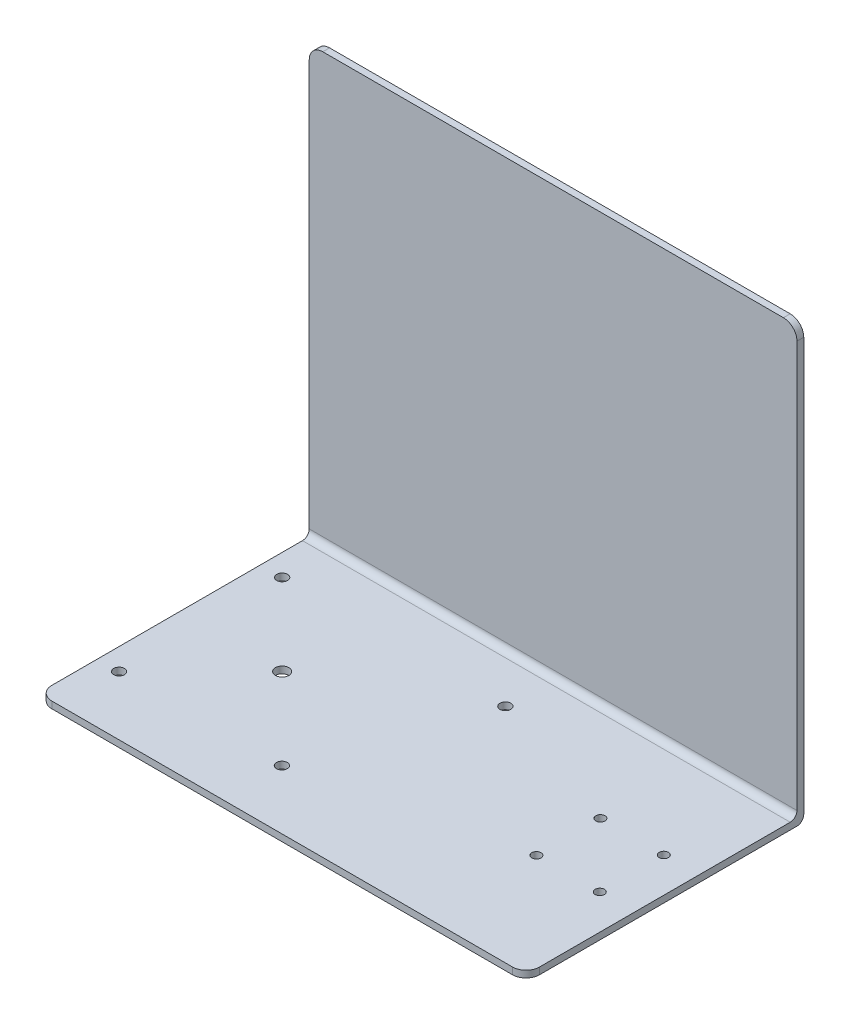
ISO-10303-21;
HEADER;
FILE_DESCRIPTION(('STEP AP214'),'2;1');
FILE_NAME('part.step','',(''),(''),'','','');
FILE_SCHEMA(('AUTOMOTIVE_DESIGN { 1 0 10303 214 1 1 1 1 }'));
ENDSEC;
DATA;
#1=APPLICATION_CONTEXT('core data for automotive mechanical design processes');
#2=APPLICATION_PROTOCOL_DEFINITION('international standard','automotive_design',2000,#1);
#3=PRODUCT_CONTEXT('',#1,'mechanical');
#4=PRODUCT('Part','Part','',(#3));
#5=PRODUCT_RELATED_PRODUCT_CATEGORY('part','',(#4));
#6=PRODUCT_DEFINITION_FORMATION('','',#4);
#7=PRODUCT_DEFINITION_CONTEXT('part definition',#1,'design');
#8=PRODUCT_DEFINITION('design','',#6,#7);
#9=PRODUCT_DEFINITION_SHAPE('','',#8);
#10=(LENGTH_UNIT() NAMED_UNIT(*) SI_UNIT(.MILLI.,.METRE.));
#11=(NAMED_UNIT(*) PLANE_ANGLE_UNIT() SI_UNIT($,.RADIAN.));
#12=(NAMED_UNIT(*) SI_UNIT($,.STERADIAN.) SOLID_ANGLE_UNIT());
#13=UNCERTAINTY_MEASURE_WITH_UNIT(LENGTH_MEASURE(1.E-05),#10,'distance_accuracy_value','');
#14=(GEOMETRIC_REPRESENTATION_CONTEXT(3) GLOBAL_UNCERTAINTY_ASSIGNED_CONTEXT((#13)) GLOBAL_UNIT_ASSIGNED_CONTEXT((#10,
#11,#12)) REPRESENTATION_CONTEXT('',''));
#15=CARTESIAN_POINT('',(0.,0.,0.));
#16=DIRECTION('',(0.,0.,1.));
#17=DIRECTION('',(1.,0.,0.));
#18=AXIS2_PLACEMENT_3D('',#15,#16,#17);
#19=CARTESIAN_POINT('',(0.,0.,3.175));
#20=DIRECTION('',(0.,0.,-1.));
#21=DIRECTION('',(-1.,0.,0.));
#22=AXIS2_PLACEMENT_3D('',#19,#20,#21);
#23=PLANE('',#22);
#24=DIRECTION('',(0.,1.,0.));
#25=VECTOR('',#24,1.);
#26=CARTESIAN_POINT('',(114.3,-101.6,3.175));
#27=LINE('',#26,#25);
#28=CARTESIAN_POINT('',(114.3,-95.25,3.175));
#29=VERTEX_POINT('',#28);
#30=CARTESIAN_POINT('',(114.3,95.25,3.175));
#31=VERTEX_POINT('',#30);
#32=EDGE_CURVE('E215',#29,#31,#27,.T.);
#33=ORIENTED_EDGE('',*,*,#32,.T.);
#34=CARTESIAN_POINT('',(107.95,95.25,3.175));
#35=DIRECTION('',(0.,0.,-1.));
#36=DIRECTION('',(-1.,0.,0.));
#37=AXIS2_PLACEMENT_3D('',#34,#35,#36);
#38=CIRCLE('',#37,6.35);
#39=CARTESIAN_POINT('',(107.95,101.6,3.175));
#40=VERTEX_POINT('',#39);
#41=EDGE_CURVE('E180',#31,#40,#38,.F.);
#42=ORIENTED_EDGE('',*,*,#41,.T.);
#43=DIRECTION('',(-1.,0.,0.));
#44=VECTOR('',#43,1.);
#45=CARTESIAN_POINT('',(-114.3,101.6,3.175));
#46=LINE('',#45,#44);
#47=CARTESIAN_POINT('',(-107.95,101.6,3.175));
#48=VERTEX_POINT('',#47);
#49=EDGE_CURVE('E218',#40,#48,#46,.T.);
#50=ORIENTED_EDGE('',*,*,#49,.T.);
#51=CARTESIAN_POINT('',(-107.95,95.25,3.175));
#52=DIRECTION('',(0.,0.,-1.));
#53=DIRECTION('',(-1.,0.,0.));
#54=AXIS2_PLACEMENT_3D('',#51,#52,#53);
#55=CIRCLE('',#54,6.35);
#56=CARTESIAN_POINT('',(-114.3,95.25,3.175));
#57=VERTEX_POINT('',#56);
#58=EDGE_CURVE('E178',#48,#57,#55,.F.);
#59=ORIENTED_EDGE('',*,*,#58,.T.);
#60=DIRECTION('',(0.,-1.,0.));
#61=VECTOR('',#60,1.);
#62=CARTESIAN_POINT('',(-114.3,-101.6,3.175));
#63=LINE('',#62,#61);
#64=CARTESIAN_POINT('',(-114.3,-95.25,3.175));
#65=VERTEX_POINT('',#64);
#66=EDGE_CURVE('E135',#57,#65,#63,.T.);
#67=ORIENTED_EDGE('',*,*,#66,.T.);
#68=DIRECTION('',(-1.,0.,0.));
#69=VECTOR('',#68,1.);
#70=CARTESIAN_POINT('',(114.3,-95.25,3.175));
#71=LINE('',#70,#69);
#72=EDGE_CURVE('E158',#65,#29,#71,.F.);
#73=ORIENTED_EDGE('',*,*,#72,.T.);
#74=EDGE_LOOP('',(#33,#42,#50,#59,#67,#73));
#75=FACE_BOUND('',#74,.T.);
#76=ADVANCED_FACE('F33',(#75),#23,.F.);
#77=CARTESIAN_POINT('',(114.3,-101.6,3.175));
#78=DIRECTION('',(-1.,0.,0.));
#79=DIRECTION('',(0.,0.,1.));
#80=AXIS2_PLACEMENT_3D('',#77,#78,#79);
#81=PLANE('',#80);
#82=DIRECTION('',(0.,1.,0.));
#83=VECTOR('',#82,1.);
#84=CARTESIAN_POINT('',(114.3,-101.6,0.));
#85=LINE('',#84,#83);
#86=CARTESIAN_POINT('',(114.3,-98.425,0.));
#87=VERTEX_POINT('',#86);
#88=CARTESIAN_POINT('',(114.3,95.25,0.));
#89=VERTEX_POINT('',#88);
#90=EDGE_CURVE('E214',#87,#89,#85,.T.);
#91=ORIENTED_EDGE('',*,*,#90,.T.);
#92=DIRECTION('',(0.,0.,-1.));
#93=VECTOR('',#92,1.);
#94=CARTESIAN_POINT('',(114.3,95.25,3.175));
#95=LINE('',#94,#93);
#96=EDGE_CURVE('E176',#89,#31,#95,.F.);
#97=ORIENTED_EDGE('',*,*,#96,.T.);
#98=ORIENTED_EDGE('',*,*,#32,.F.);
#99=CARTESIAN_POINT('',(114.3,-95.25,6.34999999999999));
#100=DIRECTION('',(-1.,0.,0.));
#101=DIRECTION('',(0.,0.,1.));
#102=AXIS2_PLACEMENT_3D('',#99,#100,#101);
#103=CIRCLE('',#102,3.175);
#104=CARTESIAN_POINT('',(114.3,-98.425,6.34999999999999));
#105=VERTEX_POINT('',#104);
#106=EDGE_CURVE('E163',#29,#105,#103,.T.);
#107=ORIENTED_EDGE('',*,*,#106,.T.);
#108=DIRECTION('',(0.,0.,-1.));
#109=VECTOR('',#108,1.);
#110=CARTESIAN_POINT('',(114.3,-98.425,130.175));
#111=LINE('',#110,#109);
#112=CARTESIAN_POINT('',(114.3,-98.425,123.825));
#113=VERTEX_POINT('',#112);
#114=EDGE_CURVE('E207',#113,#105,#111,.T.);
#115=ORIENTED_EDGE('',*,*,#114,.F.);
#116=DIRECTION('',(0.,1.,0.));
#117=VECTOR('',#116,1.);
#118=CARTESIAN_POINT('',(114.3,-101.6,123.825));
#119=LINE('',#118,#117);
#120=CARTESIAN_POINT('',(114.3,-101.6,123.825));
#121=VERTEX_POINT('',#120);
#122=EDGE_CURVE('E130',#113,#121,#119,.F.);
#123=ORIENTED_EDGE('',*,*,#122,.T.);
#124=DIRECTION('',(0.,0.,-1.));
#125=VECTOR('',#124,1.);
#126=CARTESIAN_POINT('',(114.3,-101.6,3.175));
#127=LINE('',#126,#125);
#128=CARTESIAN_POINT('',(114.3,-101.6,3.175));
#129=VERTEX_POINT('',#128);
#130=EDGE_CURVE('E123',#121,#129,#127,.T.);
#131=ORIENTED_EDGE('',*,*,#130,.T.);
#132=CARTESIAN_POINT('',(114.3,-98.425,3.175));
#133=DIRECTION('',(-1.,0.,0.));
#134=DIRECTION('',(0.,0.,1.));
#135=AXIS2_PLACEMENT_3D('',#132,#133,#134);
#136=CIRCLE('',#135,3.175);
#137=EDGE_CURVE('E127',#129,#87,#136,.F.);
#138=ORIENTED_EDGE('',*,*,#137,.T.);
#139=EDGE_LOOP('',(#91,#97,#98,#107,#115,#123,#131,#138));
#140=FACE_BOUND('',#139,.T.);
#141=ADVANCED_FACE('F126',(#140),#81,.F.);
#142=CARTESIAN_POINT('',(-114.3,101.6,3.175));
#143=DIRECTION('',(0.,-1.,0.));
#144=DIRECTION('',(0.,0.,-1.));
#145=AXIS2_PLACEMENT_3D('',#142,#143,#144);
#146=PLANE('',#145);
#147=ORIENTED_EDGE('',*,*,#49,.F.);
#148=DIRECTION('',(0.,0.,-1.));
#149=VECTOR('',#148,1.);
#150=CARTESIAN_POINT('',(107.95,101.6,3.175));
#151=LINE('',#150,#149);
#152=CARTESIAN_POINT('',(107.95,101.6,0.));
#153=VERTEX_POINT('',#152);
#154=EDGE_CURVE('E168',#40,#153,#151,.T.);
#155=ORIENTED_EDGE('',*,*,#154,.T.);
#156=DIRECTION('',(-1.,0.,0.));
#157=VECTOR('',#156,1.);
#158=CARTESIAN_POINT('',(-114.3,101.6,0.));
#159=LINE('',#158,#157);
#160=CARTESIAN_POINT('',(-107.95,101.6,0.));
#161=VERTEX_POINT('',#160);
#162=EDGE_CURVE('E224',#153,#161,#159,.T.);
#163=ORIENTED_EDGE('',*,*,#162,.T.);
#164=DIRECTION('',(0.,0.,-1.));
#165=VECTOR('',#164,1.);
#166=CARTESIAN_POINT('',(-107.95,101.6,3.175));
#167=LINE('',#166,#165);
#168=EDGE_CURVE('E166',#161,#48,#167,.F.);
#169=ORIENTED_EDGE('',*,*,#168,.T.);
#170=EDGE_LOOP('',(#147,#155,#163,#169));
#171=FACE_BOUND('',#170,.T.);
#172=ADVANCED_FACE('F242',(#171),#146,.F.);
#173=CARTESIAN_POINT('',(-114.3,-101.6,3.175));
#174=DIRECTION('',(1.,0.,0.));
#175=DIRECTION('',(0.,0.,-1.));
#176=AXIS2_PLACEMENT_3D('',#173,#174,#175);
#177=PLANE('',#176);
#178=ORIENTED_EDGE('',*,*,#66,.F.);
#179=DIRECTION('',(0.,0.,-1.));
#180=VECTOR('',#179,1.);
#181=CARTESIAN_POINT('',(-114.3,95.25,3.175));
#182=LINE('',#181,#180);
#183=CARTESIAN_POINT('',(-114.3,95.25,0.));
#184=VERTEX_POINT('',#183);
#185=EDGE_CURVE('E184',#57,#184,#182,.T.);
#186=ORIENTED_EDGE('',*,*,#185,.T.);
#187=DIRECTION('',(0.,-1.,0.));
#188=VECTOR('',#187,1.);
#189=CARTESIAN_POINT('',(-114.3,-101.6,0.));
#190=LINE('',#189,#188);
#191=CARTESIAN_POINT('',(-114.3,-98.425,0.));
#192=VERTEX_POINT('',#191);
#193=EDGE_CURVE('E219',#184,#192,#190,.T.);
#194=ORIENTED_EDGE('',*,*,#193,.T.);
#195=CARTESIAN_POINT('',(-114.3,-98.425,3.175));
#196=DIRECTION('',(1.,0.,0.));
#197=DIRECTION('',(0.,0.,-1.));
#198=AXIS2_PLACEMENT_3D('',#195,#196,#197);
#199=CIRCLE('',#198,3.175);
#200=CARTESIAN_POINT('',(-114.3,-101.6,3.175));
#201=VERTEX_POINT('',#200);
#202=EDGE_CURVE('E153',#192,#201,#199,.F.);
#203=ORIENTED_EDGE('',*,*,#202,.T.);
#204=DIRECTION('',(0.,0.,-1.));
#205=VECTOR('',#204,1.);
#206=CARTESIAN_POINT('',(-114.3,-101.6,3.175));
#207=LINE('',#206,#205);
#208=CARTESIAN_POINT('',(-114.3,-101.6,123.825));
#209=VERTEX_POINT('',#208);
#210=EDGE_CURVE('E134',#209,#201,#207,.T.);
#211=ORIENTED_EDGE('',*,*,#210,.F.);
#212=DIRECTION('',(0.,-1.,0.));
#213=VECTOR('',#212,1.);
#214=CARTESIAN_POINT('',(-114.3,-101.6,123.825));
#215=LINE('',#214,#213);
#216=CARTESIAN_POINT('',(-114.3,-98.425,123.825));
#217=VERTEX_POINT('',#216);
#218=EDGE_CURVE('E182',#209,#217,#215,.F.);
#219=ORIENTED_EDGE('',*,*,#218,.T.);
#220=DIRECTION('',(0.,0.,-1.));
#221=VECTOR('',#220,1.);
#222=CARTESIAN_POINT('',(-114.3,-98.425,130.175));
#223=LINE('',#222,#221);
#224=CARTESIAN_POINT('',(-114.3,-98.425,6.34999999999999));
#225=VERTEX_POINT('',#224);
#226=EDGE_CURVE('E205',#217,#225,#223,.T.);
#227=ORIENTED_EDGE('',*,*,#226,.T.);
#228=CARTESIAN_POINT('',(-114.3,-95.25,6.34999999999999));
#229=DIRECTION('',(1.,0.,0.));
#230=DIRECTION('',(0.,0.,-1.));
#231=AXIS2_PLACEMENT_3D('',#228,#229,#230);
#232=CIRCLE('',#231,3.175);
#233=EDGE_CURVE('E160',#225,#65,#232,.T.);
#234=ORIENTED_EDGE('',*,*,#233,.T.);
#235=EDGE_LOOP('',(#178,#186,#194,#203,#211,#219,#227,#234));
#236=FACE_BOUND('',#235,.T.);
#237=ADVANCED_FACE('F201',(#236),#177,.F.);
#238=CARTESIAN_POINT('',(-114.3,-101.6,3.175));
#239=DIRECTION('',(0.,1.,0.));
#240=DIRECTION('',(0.,0.,1.));
#241=AXIS2_PLACEMENT_3D('',#238,#239,#240);
#242=PLANE('',#241);
#243=CARTESIAN_POINT('',(68.2499999999999,-101.6,49.2493000000003));
#244=DIRECTION('',(0.,1.,0.));
#245=DIRECTION('',(0.,0.,1.));
#246=AXIS2_PLACEMENT_3D('',#243,#244,#245);
#247=CIRCLE('',#246,2.14999999999999);
#248=CARTESIAN_POINT('',(68.2499999999999,-101.6,51.3993000000003));
#249=VERTEX_POINT('',#248);
#250=EDGE_CURVE('E371',#249,#249,#247,.T.);
#251=ORIENTED_EDGE('',*,*,#250,.T.);
#252=EDGE_LOOP('',(#251));
#253=FACE_BOUND('',#252,.T.);
#254=CARTESIAN_POINT('',(-27.8257,-101.6,102.4636));
#255=DIRECTION('',(0.,1.,0.));
#256=DIRECTION('',(0.,0.,1.));
#257=AXIS2_PLACEMENT_3D('',#254,#255,#256);
#258=CIRCLE('',#257,2.53999999999999);
#259=CARTESIAN_POINT('',(-27.8257,-101.6,105.0036));
#260=VERTEX_POINT('',#259);
#261=EDGE_CURVE('E364',#260,#260,#258,.T.);
#262=ORIENTED_EDGE('',*,*,#261,.T.);
#263=EDGE_LOOP('',(#262));
#264=FACE_BOUND('',#263,.T.);
#265=CARTESIAN_POINT('',(0.482599999999993,-101.6,26.035));
#266=DIRECTION('',(0.,1.,0.));
#267=DIRECTION('',(0.,0.,1.));
#268=AXIS2_PLACEMENT_3D('',#265,#266,#267);
#269=CIRCLE('',#268,2.54);
#270=CARTESIAN_POINT('',(0.482599999999993,-101.6,28.575));
#271=VERTEX_POINT('',#270);
#272=EDGE_CURVE('E383',#271,#271,#269,.T.);
#273=ORIENTED_EDGE('',*,*,#272,.T.);
#274=EDGE_LOOP('',(#273));
#275=FACE_BOUND('',#274,.T.);
#276=CARTESIAN_POINT('',(-104.14,-101.6,102.4636));
#277=DIRECTION('',(0.,1.,0.));
#278=DIRECTION('',(0.,0.,1.));
#279=AXIS2_PLACEMENT_3D('',#276,#277,#278);
#280=CIRCLE('',#279,2.53999999999998);
#281=CARTESIAN_POINT('',(-104.14,-101.6,105.0036));
#282=VERTEX_POINT('',#281);
#283=EDGE_CURVE('E376',#282,#282,#280,.T.);
#284=ORIENTED_EDGE('',*,*,#283,.T.);
#285=EDGE_LOOP('',(#284));
#286=FACE_BOUND('',#285,.T.);
#287=CARTESIAN_POINT('',(-65.9257,-101.6,64.2493));
#288=DIRECTION('',(0.,1.,0.));
#289=DIRECTION('',(0.,0.,1.));
#290=AXIS2_PLACEMENT_3D('',#287,#288,#289);
#291=CIRCLE('',#290,3.175);
#292=CARTESIAN_POINT('',(-65.9257,-101.6,67.4243));
#293=VERTEX_POINT('',#292);
#294=EDGE_CURVE('E342',#293,#293,#291,.T.);
#295=ORIENTED_EDGE('',*,*,#294,.T.);
#296=EDGE_LOOP('',(#295));
#297=FACE_BOUND('',#296,.T.);
#298=CARTESIAN_POINT('',(97.9499999999999,-101.6,79.2493));
#299=DIRECTION('',(0.,1.,0.));
#300=DIRECTION('',(0.,0.,1.));
#301=AXIS2_PLACEMENT_3D('',#298,#299,#300);
#302=CIRCLE('',#301,2.14999999999999);
#303=CARTESIAN_POINT('',(97.9499999999999,-101.6,81.3993));
#304=VERTEX_POINT('',#303);
#305=EDGE_CURVE('E337',#304,#304,#302,.T.);
#306=ORIENTED_EDGE('',*,*,#305,.T.);
#307=EDGE_LOOP('',(#306));
#308=FACE_BOUND('',#307,.T.);
#309=CARTESIAN_POINT('',(68.2499999999999,-101.6,79.2493));
#310=DIRECTION('',(0.,1.,0.));
#311=DIRECTION('',(0.,0.,1.));
#312=AXIS2_PLACEMENT_3D('',#309,#310,#311);
#313=CIRCLE('',#312,2.15);
#314=CARTESIAN_POINT('',(68.2499999999999,-101.6,81.3993));
#315=VERTEX_POINT('',#314);
#316=EDGE_CURVE('E359',#315,#315,#313,.T.);
#317=ORIENTED_EDGE('',*,*,#316,.T.);
#318=EDGE_LOOP('',(#317));
#319=FACE_BOUND('',#318,.T.);
#320=CARTESIAN_POINT('',(97.9499999999999,-101.6,49.2493000000001));
#321=DIRECTION('',(0.,1.,0.));
#322=DIRECTION('',(0.,0.,1.));
#323=AXIS2_PLACEMENT_3D('',#320,#321,#322);
#324=CIRCLE('',#323,2.14999999999999);
#325=CARTESIAN_POINT('',(97.9499999999999,-101.6,51.3993000000001));
#326=VERTEX_POINT('',#325);
#327=EDGE_CURVE('E352',#326,#326,#324,.T.);
#328=ORIENTED_EDGE('',*,*,#327,.T.);
#329=EDGE_LOOP('',(#328));
#330=FACE_BOUND('',#329,.T.);
#331=CARTESIAN_POINT('',(-104.14,-101.6,26.035));
#332=DIRECTION('',(0.,1.,0.));
#333=DIRECTION('',(0.,0.,1.));
#334=AXIS2_PLACEMENT_3D('',#331,#332,#333);
#335=CIRCLE('',#334,2.53999999999998);
#336=CARTESIAN_POINT('',(-104.14,-101.6,28.575));
#337=VERTEX_POINT('',#336);
#338=EDGE_CURVE('E209',#337,#337,#335,.T.);
#339=ORIENTED_EDGE('',*,*,#338,.T.);
#340=EDGE_LOOP('',(#339));
#341=FACE_BOUND('',#340,.T.);
#342=ORIENTED_EDGE('',*,*,#130,.F.);
#343=CARTESIAN_POINT('',(107.95,-101.6,123.825));
#344=DIRECTION('',(0.,1.,0.));
#345=DIRECTION('',(0.,0.,1.));
#346=AXIS2_PLACEMENT_3D('',#343,#344,#345);
#347=CIRCLE('',#346,6.35);
#348=CARTESIAN_POINT('',(107.95,-101.6,130.175));
#349=VERTEX_POINT('',#348);
#350=EDGE_CURVE('E11',#121,#349,#347,.F.);
#351=ORIENTED_EDGE('',*,*,#350,.T.);
#352=DIRECTION('',(1.,0.,0.));
#353=VECTOR('',#352,1.);
#354=CARTESIAN_POINT('',(-114.3,-101.6,130.175));
#355=LINE('',#354,#353);
#356=CARTESIAN_POINT('',(-107.95,-101.6,130.175));
#357=VERTEX_POINT('',#356);
#358=EDGE_CURVE('E195',#357,#349,#355,.T.);
#359=ORIENTED_EDGE('',*,*,#358,.F.);
#360=CARTESIAN_POINT('',(-107.95,-101.6,123.825));
#361=DIRECTION('',(0.,1.,0.));
#362=DIRECTION('',(0.,0.,1.));
#363=AXIS2_PLACEMENT_3D('',#360,#361,#362);
#364=CIRCLE('',#363,6.35);
#365=EDGE_CURVE('E41',#357,#209,#364,.F.);
#366=ORIENTED_EDGE('',*,*,#365,.T.);
#367=ORIENTED_EDGE('',*,*,#210,.T.);
#368=DIRECTION('',(1.,0.,0.));
#369=VECTOR('',#368,1.);
#370=CARTESIAN_POINT('',(114.3,-101.6,3.175));
#371=LINE('',#370,#369);
#372=EDGE_CURVE('E142',#201,#129,#371,.T.);
#373=ORIENTED_EDGE('',*,*,#372,.T.);
#374=EDGE_LOOP('',(#342,#351,#359,#366,#367,#373));
#375=FACE_BOUND('',#374,.T.);
#376=ADVANCED_FACE('F146',(#253,#264,#275,#286,#297,#308,#319,#330,#341,#375),#242,.F.);
#377=CARTESIAN_POINT('',(0.,0.,0.));
#378=DIRECTION('',(0.,0.,-1.));
#379=DIRECTION('',(-1.,0.,0.));
#380=AXIS2_PLACEMENT_3D('',#377,#378,#379);
#381=PLANE('',#380);
#382=ORIENTED_EDGE('',*,*,#162,.F.);
#383=CARTESIAN_POINT('',(107.95,95.25,0.));
#384=DIRECTION('',(0.,0.,-1.));
#385=DIRECTION('',(-1.,0.,0.));
#386=AXIS2_PLACEMENT_3D('',#383,#384,#385);
#387=CIRCLE('',#386,6.35);
#388=EDGE_CURVE('E173',#153,#89,#387,.T.);
#389=ORIENTED_EDGE('',*,*,#388,.T.);
#390=ORIENTED_EDGE('',*,*,#90,.F.);
#391=DIRECTION('',(1.,0.,0.));
#392=VECTOR('',#391,1.);
#393=CARTESIAN_POINT('',(-114.3,-98.425,0.));
#394=LINE('',#393,#392);
#395=EDGE_CURVE('E144',#87,#192,#394,.F.);
#396=ORIENTED_EDGE('',*,*,#395,.T.);
#397=ORIENTED_EDGE('',*,*,#193,.F.);
#398=CARTESIAN_POINT('',(-107.95,95.25,0.));
#399=DIRECTION('',(0.,0.,-1.));
#400=DIRECTION('',(-1.,0.,0.));
#401=AXIS2_PLACEMENT_3D('',#398,#399,#400);
#402=CIRCLE('',#401,6.35);
#403=EDGE_CURVE('E171',#184,#161,#402,.T.);
#404=ORIENTED_EDGE('',*,*,#403,.T.);
#405=EDGE_LOOP('',(#382,#389,#390,#396,#397,#404));
#406=FACE_BOUND('',#405,.T.);
#407=ADVANCED_FACE('F231',(#406),#381,.T.);
#408=CARTESIAN_POINT('',(-114.3,-98.425,130.175));
#409=DIRECTION('',(0.,-1.,0.));
#410=DIRECTION('',(0.,0.,-1.));
#411=AXIS2_PLACEMENT_3D('',#408,#409,#410);
#412=PLANE('',#411);
#413=CARTESIAN_POINT('',(68.2499999999999,-98.425,49.2493000000003));
#414=DIRECTION('',(0.,1.,0.));
#415=DIRECTION('',(0.,0.,1.));
#416=AXIS2_PLACEMENT_3D('',#413,#414,#415);
#417=CIRCLE('',#416,2.14999999999999);
#418=CARTESIAN_POINT('',(68.2499999999999,-98.425,51.3993000000003));
#419=VERTEX_POINT('',#418);
#420=EDGE_CURVE('E355',#419,#419,#417,.T.);
#421=ORIENTED_EDGE('',*,*,#420,.F.);
#422=EDGE_LOOP('',(#421));
#423=FACE_BOUND('',#422,.T.);
#424=CARTESIAN_POINT('',(-27.8257,-98.425,102.4636));
#425=DIRECTION('',(0.,1.,0.));
#426=DIRECTION('',(0.,0.,1.));
#427=AXIS2_PLACEMENT_3D('',#424,#425,#426);
#428=CIRCLE('',#427,2.53999999999999);
#429=CARTESIAN_POINT('',(-27.8257,-98.425,105.0036));
#430=VERTEX_POINT('',#429);
#431=EDGE_CURVE('E368',#430,#430,#428,.T.);
#432=ORIENTED_EDGE('',*,*,#431,.F.);
#433=EDGE_LOOP('',(#432));
#434=FACE_BOUND('',#433,.T.);
#435=CARTESIAN_POINT('',(0.482599999999993,-98.425,26.035));
#436=DIRECTION('',(0.,1.,0.));
#437=DIRECTION('',(0.,0.,1.));
#438=AXIS2_PLACEMENT_3D('',#435,#436,#437);
#439=CIRCLE('',#438,2.54);
#440=CARTESIAN_POINT('',(0.482599999999993,-98.425,28.575));
#441=VERTEX_POINT('',#440);
#442=EDGE_CURVE('E367',#441,#441,#439,.T.);
#443=ORIENTED_EDGE('',*,*,#442,.F.);
#444=EDGE_LOOP('',(#443));
#445=FACE_BOUND('',#444,.T.);
#446=CARTESIAN_POINT('',(-104.14,-98.425,102.4636));
#447=DIRECTION('',(0.,1.,0.));
#448=DIRECTION('',(0.,0.,1.));
#449=AXIS2_PLACEMENT_3D('',#446,#447,#448);
#450=CIRCLE('',#449,2.53999999999998);
#451=CARTESIAN_POINT('',(-104.14,-98.425,105.0036));
#452=VERTEX_POINT('',#451);
#453=EDGE_CURVE('E380',#452,#452,#450,.T.);
#454=ORIENTED_EDGE('',*,*,#453,.F.);
#455=EDGE_LOOP('',(#454));
#456=FACE_BOUND('',#455,.T.);
#457=CARTESIAN_POINT('',(-65.9257,-98.425,64.2493));
#458=DIRECTION('',(0.,1.,0.));
#459=DIRECTION('',(0.,0.,1.));
#460=AXIS2_PLACEMENT_3D('',#457,#458,#459);
#461=CIRCLE('',#460,3.175);
#462=CARTESIAN_POINT('',(-65.9257,-98.425,67.4243));
#463=VERTEX_POINT('',#462);
#464=EDGE_CURVE('E347',#463,#463,#461,.T.);
#465=ORIENTED_EDGE('',*,*,#464,.F.);
#466=EDGE_LOOP('',(#465));
#467=FACE_BOUND('',#466,.T.);
#468=CARTESIAN_POINT('',(97.9499999999999,-98.425,79.2493));
#469=DIRECTION('',(0.,1.,0.));
#470=DIRECTION('',(0.,0.,1.));
#471=AXIS2_PLACEMENT_3D('',#468,#469,#470);
#472=CIRCLE('',#471,2.14999999999999);
#473=CARTESIAN_POINT('',(97.9499999999999,-98.425,81.3993));
#474=VERTEX_POINT('',#473);
#475=EDGE_CURVE('E340',#474,#474,#472,.T.);
#476=ORIENTED_EDGE('',*,*,#475,.F.);
#477=EDGE_LOOP('',(#476));
#478=FACE_BOUND('',#477,.T.);
#479=CARTESIAN_POINT('',(68.2499999999999,-98.425,79.2493));
#480=DIRECTION('',(0.,1.,0.));
#481=DIRECTION('',(0.,0.,1.));
#482=AXIS2_PLACEMENT_3D('',#479,#480,#481);
#483=CIRCLE('',#482,2.15);
#484=CARTESIAN_POINT('',(68.2499999999999,-98.425,81.3993));
#485=VERTEX_POINT('',#484);
#486=EDGE_CURVE('E344',#485,#485,#483,.T.);
#487=ORIENTED_EDGE('',*,*,#486,.F.);
#488=EDGE_LOOP('',(#487));
#489=FACE_BOUND('',#488,.T.);
#490=CARTESIAN_POINT('',(97.9499999999999,-98.425,49.2493000000001));
#491=DIRECTION('',(0.,1.,0.));
#492=DIRECTION('',(0.,0.,1.));
#493=AXIS2_PLACEMENT_3D('',#490,#491,#492);
#494=CIRCLE('',#493,2.14999999999999);
#495=CARTESIAN_POINT('',(97.9499999999999,-98.425,51.3993000000001));
#496=VERTEX_POINT('',#495);
#497=EDGE_CURVE('E356',#496,#496,#494,.T.);
#498=ORIENTED_EDGE('',*,*,#497,.F.);
#499=EDGE_LOOP('',(#498));
#500=FACE_BOUND('',#499,.T.);
#501=CARTESIAN_POINT('',(-104.14,-98.425,26.035));
#502=DIRECTION('',(0.,1.,0.));
#503=DIRECTION('',(0.,0.,1.));
#504=AXIS2_PLACEMENT_3D('',#501,#502,#503);
#505=CIRCLE('',#504,2.53999999999998);
#506=CARTESIAN_POINT('',(-104.14,-98.425,28.575));
#507=VERTEX_POINT('',#506);
#508=EDGE_CURVE('E379',#507,#507,#505,.T.);
#509=ORIENTED_EDGE('',*,*,#508,.F.);
#510=EDGE_LOOP('',(#509));
#511=FACE_BOUND('',#510,.T.);
#512=DIRECTION('',(-1.,0.,0.));
#513=VECTOR('',#512,1.);
#514=CARTESIAN_POINT('',(-114.3,-98.425,130.175));
#515=LINE('',#514,#513);
#516=CARTESIAN_POINT('',(107.95,-98.425,130.175));
#517=VERTEX_POINT('',#516);
#518=CARTESIAN_POINT('',(-107.95,-98.425,130.175));
#519=VERTEX_POINT('',#518);
#520=EDGE_CURVE('E204',#517,#519,#515,.T.);
#521=ORIENTED_EDGE('',*,*,#520,.F.);
#522=CARTESIAN_POINT('',(107.95,-98.425,123.825));
#523=DIRECTION('',(0.,-1.,0.));
#524=DIRECTION('',(0.,0.,-1.));
#525=AXIS2_PLACEMENT_3D('',#522,#523,#524);
#526=CIRCLE('',#525,6.35);
#527=EDGE_CURVE('E56',#517,#113,#526,.F.);
#528=ORIENTED_EDGE('',*,*,#527,.T.);
#529=ORIENTED_EDGE('',*,*,#114,.T.);
#530=DIRECTION('',(-1.,0.,0.));
#531=VECTOR('',#530,1.);
#532=CARTESIAN_POINT('',(-114.3,-98.425,6.34999999999999));
#533=LINE('',#532,#531);
#534=EDGE_CURVE('E155',#105,#225,#533,.T.);
#535=ORIENTED_EDGE('',*,*,#534,.T.);
#536=ORIENTED_EDGE('',*,*,#226,.F.);
#537=CARTESIAN_POINT('',(-107.95,-98.425,123.825));
#538=DIRECTION('',(0.,-1.,0.));
#539=DIRECTION('',(0.,0.,-1.));
#540=AXIS2_PLACEMENT_3D('',#537,#538,#539);
#541=CIRCLE('',#540,6.35);
#542=EDGE_CURVE('E48',#217,#519,#541,.F.);
#543=ORIENTED_EDGE('',*,*,#542,.T.);
#544=EDGE_LOOP('',(#521,#528,#529,#535,#536,#543));
#545=FACE_BOUND('',#544,.T.);
#546=ADVANCED_FACE('F252',(#423,#434,#445,#456,#467,#478,#489,#500,#511,#545),#412,.F.);
#547=CARTESIAN_POINT('',(0.,0.,130.175));
#548=DIRECTION('',(0.,0.,-1.));
#549=DIRECTION('',(-1.,0.,0.));
#550=AXIS2_PLACEMENT_3D('',#547,#548,#549);
#551=PLANE('',#550);
#552=ORIENTED_EDGE('',*,*,#358,.T.);
#553=DIRECTION('',(0.,1.,0.));
#554=VECTOR('',#553,1.);
#555=CARTESIAN_POINT('',(107.95,0.,130.175));
#556=LINE('',#555,#554);
#557=EDGE_CURVE('E190',#349,#517,#556,.T.);
#558=ORIENTED_EDGE('',*,*,#557,.T.);
#559=ORIENTED_EDGE('',*,*,#520,.T.);
#560=DIRECTION('',(0.,-1.,0.));
#561=VECTOR('',#560,1.);
#562=CARTESIAN_POINT('',(-107.95,0.,130.175));
#563=LINE('',#562,#561);
#564=EDGE_CURVE('E187',#519,#357,#563,.T.);
#565=ORIENTED_EDGE('',*,*,#564,.T.);
#566=EDGE_LOOP('',(#552,#558,#559,#565));
#567=FACE_BOUND('',#566,.T.);
#568=ADVANCED_FACE('F203',(#567),#551,.F.);
#569=CARTESIAN_POINT('',(-114.3,-98.425,3.175));
#570=DIRECTION('',(-1.,0.,0.));
#571=DIRECTION('',(0.,0.,1.));
#572=AXIS2_PLACEMENT_3D('',#569,#570,#571);
#573=CYLINDRICAL_SURFACE('',#572,3.175);
#574=ORIENTED_EDGE('',*,*,#202,.F.);
#575=ORIENTED_EDGE('',*,*,#395,.F.);
#576=ORIENTED_EDGE('',*,*,#137,.F.);
#577=ORIENTED_EDGE('',*,*,#372,.F.);
#578=EDGE_LOOP('',(#574,#575,#576,#577));
#579=FACE_BOUND('',#578,.T.);
#580=ADVANCED_FACE('F141',(#579),#573,.T.);
#581=CARTESIAN_POINT('',(-114.3,-95.25,6.34999999999999));
#582=DIRECTION('',(1.,0.,0.));
#583=DIRECTION('',(0.,0.,-1.));
#584=AXIS2_PLACEMENT_3D('',#581,#582,#583);
#585=CYLINDRICAL_SURFACE('',#584,3.175);
#586=ORIENTED_EDGE('',*,*,#106,.F.);
#587=ORIENTED_EDGE('',*,*,#72,.F.);
#588=ORIENTED_EDGE('',*,*,#233,.F.);
#589=ORIENTED_EDGE('',*,*,#534,.F.);
#590=EDGE_LOOP('',(#586,#587,#588,#589));
#591=FACE_BOUND('',#590,.T.);
#592=ADVANCED_FACE('F251',(#591),#585,.F.);
#593=CARTESIAN_POINT('',(107.95,95.25,3.175));
#594=DIRECTION('',(0.,0.,-1.));
#595=DIRECTION('',(-1.,0.,0.));
#596=AXIS2_PLACEMENT_3D('',#593,#594,#595);
#597=CYLINDRICAL_SURFACE('',#596,6.35);
#598=ORIENTED_EDGE('',*,*,#41,.F.);
#599=ORIENTED_EDGE('',*,*,#96,.F.);
#600=ORIENTED_EDGE('',*,*,#388,.F.);
#601=ORIENTED_EDGE('',*,*,#154,.F.);
#602=EDGE_LOOP('',(#598,#599,#600,#601));
#603=FACE_BOUND('',#602,.T.);
#604=ADVANCED_FACE('F236',(#603),#597,.T.);
#605=CARTESIAN_POINT('',(-107.95,95.25,3.175));
#606=DIRECTION('',(0.,0.,-1.));
#607=DIRECTION('',(-1.,0.,0.));
#608=AXIS2_PLACEMENT_3D('',#605,#606,#607);
#609=CYLINDRICAL_SURFACE('',#608,6.35);
#610=ORIENTED_EDGE('',*,*,#58,.F.);
#611=ORIENTED_EDGE('',*,*,#168,.F.);
#612=ORIENTED_EDGE('',*,*,#403,.F.);
#613=ORIENTED_EDGE('',*,*,#185,.F.);
#614=EDGE_LOOP('',(#610,#611,#612,#613));
#615=FACE_BOUND('',#614,.T.);
#616=ADVANCED_FACE('F245',(#615),#609,.T.);
#617=CARTESIAN_POINT('',(107.95,0.,123.825));
#618=DIRECTION('',(0.,1.,0.));
#619=DIRECTION('',(0.,0.,1.));
#620=AXIS2_PLACEMENT_3D('',#617,#618,#619);
#621=CYLINDRICAL_SURFACE('',#620,6.35);
#622=ORIENTED_EDGE('',*,*,#350,.F.);
#623=ORIENTED_EDGE('',*,*,#122,.F.);
#624=ORIENTED_EDGE('',*,*,#527,.F.);
#625=ORIENTED_EDGE('',*,*,#557,.F.);
#626=EDGE_LOOP('',(#622,#623,#624,#625));
#627=FACE_BOUND('',#626,.T.);
#628=ADVANCED_FACE('F285',(#627),#621,.T.);
#629=CARTESIAN_POINT('',(-107.95,0.,123.825));
#630=DIRECTION('',(0.,-1.,0.));
#631=DIRECTION('',(0.,0.,-1.));
#632=AXIS2_PLACEMENT_3D('',#629,#630,#631);
#633=CYLINDRICAL_SURFACE('',#632,6.35);
#634=ORIENTED_EDGE('',*,*,#542,.F.);
#635=ORIENTED_EDGE('',*,*,#218,.F.);
#636=ORIENTED_EDGE('',*,*,#365,.F.);
#637=ORIENTED_EDGE('',*,*,#564,.F.);
#638=EDGE_LOOP('',(#634,#635,#636,#637));
#639=FACE_BOUND('',#638,.T.);
#640=ADVANCED_FACE('F35',(#639),#633,.T.);
#641=CARTESIAN_POINT('',(-104.14,-101.6,26.035));
#642=DIRECTION('',(0.,1.,0.));
#643=DIRECTION('',(0.,0.,1.));
#644=AXIS2_PLACEMENT_3D('',#641,#642,#643);
#645=CYLINDRICAL_SURFACE('',#644,2.53999999999998);
#646=ORIENTED_EDGE('',*,*,#338,.F.);
#647=EDGE_LOOP('',(#646));
#648=FACE_BOUND('',#647,.T.);
#649=ORIENTED_EDGE('',*,*,#508,.T.);
#650=EDGE_LOOP('',(#649));
#651=FACE_BOUND('',#650,.T.);
#652=ADVANCED_FACE('F290',(#648,#651),#645,.F.);
#653=CARTESIAN_POINT('',(97.9499999999999,-101.6,49.2493000000001));
#654=DIRECTION('',(0.,1.,0.));
#655=DIRECTION('',(0.,0.,1.));
#656=AXIS2_PLACEMENT_3D('',#653,#654,#655);
#657=CYLINDRICAL_SURFACE('',#656,2.14999999999999);
#658=ORIENTED_EDGE('',*,*,#327,.F.);
#659=EDGE_LOOP('',(#658));
#660=FACE_BOUND('',#659,.T.);
#661=ORIENTED_EDGE('',*,*,#497,.T.);
#662=EDGE_LOOP('',(#661));
#663=FACE_BOUND('',#662,.T.);
#664=ADVANCED_FACE('F294',(#660,#663),#657,.F.);
#665=CARTESIAN_POINT('',(68.2499999999999,-101.6,79.2493));
#666=DIRECTION('',(0.,1.,0.));
#667=DIRECTION('',(0.,0.,1.));
#668=AXIS2_PLACEMENT_3D('',#665,#666,#667);
#669=CYLINDRICAL_SURFACE('',#668,2.15);
#670=ORIENTED_EDGE('',*,*,#316,.F.);
#671=EDGE_LOOP('',(#670));
#672=FACE_BOUND('',#671,.T.);
#673=ORIENTED_EDGE('',*,*,#486,.T.);
#674=EDGE_LOOP('',(#673));
#675=FACE_BOUND('',#674,.T.);
#676=ADVANCED_FACE('F300',(#672,#675),#669,.F.);
#677=CARTESIAN_POINT('',(97.9499999999999,-101.6,79.2493));
#678=DIRECTION('',(0.,1.,0.));
#679=DIRECTION('',(0.,0.,1.));
#680=AXIS2_PLACEMENT_3D('',#677,#678,#679);
#681=CYLINDRICAL_SURFACE('',#680,2.14999999999999);
#682=ORIENTED_EDGE('',*,*,#305,.F.);
#683=EDGE_LOOP('',(#682));
#684=FACE_BOUND('',#683,.T.);
#685=ORIENTED_EDGE('',*,*,#475,.T.);
#686=EDGE_LOOP('',(#685));
#687=FACE_BOUND('',#686,.T.);
#688=ADVANCED_FACE('F324',(#684,#687),#681,.F.);
#689=CARTESIAN_POINT('',(-65.9257,-101.6,64.2493));
#690=DIRECTION('',(0.,1.,0.));
#691=DIRECTION('',(0.,0.,1.));
#692=AXIS2_PLACEMENT_3D('',#689,#690,#691);
#693=CYLINDRICAL_SURFACE('',#692,3.175);
#694=ORIENTED_EDGE('',*,*,#294,.F.);
#695=EDGE_LOOP('',(#694));
#696=FACE_BOUND('',#695,.T.);
#697=ORIENTED_EDGE('',*,*,#464,.T.);
#698=EDGE_LOOP('',(#697));
#699=FACE_BOUND('',#698,.T.);
#700=ADVANCED_FACE('F314',(#696,#699),#693,.F.);
#701=CARTESIAN_POINT('',(-104.14,-101.6,102.4636));
#702=DIRECTION('',(0.,1.,0.));
#703=DIRECTION('',(0.,0.,1.));
#704=AXIS2_PLACEMENT_3D('',#701,#702,#703);
#705=CYLINDRICAL_SURFACE('',#704,2.53999999999998);
#706=ORIENTED_EDGE('',*,*,#283,.F.);
#707=EDGE_LOOP('',(#706));
#708=FACE_BOUND('',#707,.T.);
#709=ORIENTED_EDGE('',*,*,#453,.T.);
#710=EDGE_LOOP('',(#709));
#711=FACE_BOUND('',#710,.T.);
#712=ADVANCED_FACE('F310',(#708,#711),#705,.F.);
#713=CARTESIAN_POINT('',(0.482599999999993,-101.6,26.035));
#714=DIRECTION('',(0.,1.,0.));
#715=DIRECTION('',(0.,0.,1.));
#716=AXIS2_PLACEMENT_3D('',#713,#714,#715);
#717=CYLINDRICAL_SURFACE('',#716,2.54);
#718=ORIENTED_EDGE('',*,*,#272,.F.);
#719=EDGE_LOOP('',(#718));
#720=FACE_BOUND('',#719,.T.);
#721=ORIENTED_EDGE('',*,*,#442,.T.);
#722=EDGE_LOOP('',(#721));
#723=FACE_BOUND('',#722,.T.);
#724=ADVANCED_FACE('F306',(#720,#723),#717,.F.);
#725=CARTESIAN_POINT('',(-27.8257,-101.6,102.4636));
#726=DIRECTION('',(0.,1.,0.));
#727=DIRECTION('',(0.,0.,1.));
#728=AXIS2_PLACEMENT_3D('',#725,#726,#727);
#729=CYLINDRICAL_SURFACE('',#728,2.53999999999999);
#730=ORIENTED_EDGE('',*,*,#261,.F.);
#731=EDGE_LOOP('',(#730));
#732=FACE_BOUND('',#731,.T.);
#733=ORIENTED_EDGE('',*,*,#431,.T.);
#734=EDGE_LOOP('',(#733));
#735=FACE_BOUND('',#734,.T.);
#736=ADVANCED_FACE('F309',(#732,#735),#729,.F.);
#737=CARTESIAN_POINT('',(68.2499999999999,-101.6,49.2493000000003));
#738=DIRECTION('',(0.,1.,0.));
#739=DIRECTION('',(0.,0.,1.));
#740=AXIS2_PLACEMENT_3D('',#737,#738,#739);
#741=CYLINDRICAL_SURFACE('',#740,2.14999999999999);
#742=ORIENTED_EDGE('',*,*,#250,.F.);
#743=EDGE_LOOP('',(#742));
#744=FACE_BOUND('',#743,.T.);
#745=ORIENTED_EDGE('',*,*,#420,.T.);
#746=EDGE_LOOP('',(#745));
#747=FACE_BOUND('',#746,.T.);
#748=ADVANCED_FACE('F316',(#744,#747),#741,.F.);
#749=CLOSED_SHELL('',(#76,#141,#172,#237,#376,#407,#546,#568,#580,#592,#604,#616,#628,#640,#652,
#664,#676,#688,#700,#712,#724,#736,#748));
#750=MANIFOLD_SOLID_BREP('B2',#749);
#751=ADVANCED_BREP_SHAPE_REPRESENTATION('',(#18,#750),#14);
#752=SHAPE_DEFINITION_REPRESENTATION(#9,#751);
ENDSEC;
END-ISO-10303-21;
